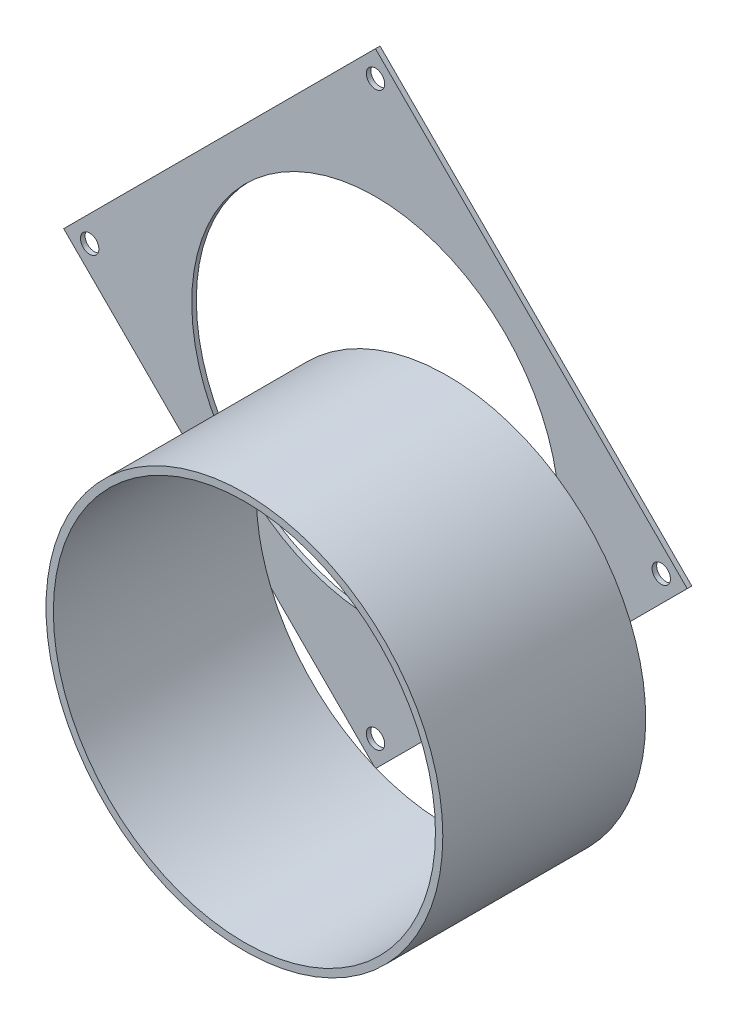
ISO-10303-21;
HEADER;
FILE_DESCRIPTION(('STEP AP214'),'2;1');
FILE_NAME('part.step','',(''),(''),'','','');
FILE_SCHEMA(('AUTOMOTIVE_DESIGN { 1 0 10303 214 1 1 1 1 }'));
ENDSEC;
DATA;
#1=APPLICATION_CONTEXT('core data for automotive mechanical design processes');
#2=APPLICATION_PROTOCOL_DEFINITION('international standard','automotive_design',2000,#1);
#3=PRODUCT_CONTEXT('',#1,'mechanical');
#4=PRODUCT('Part','Part','',(#3));
#5=PRODUCT_RELATED_PRODUCT_CATEGORY('part','',(#4));
#6=PRODUCT_DEFINITION_FORMATION('','',#4);
#7=PRODUCT_DEFINITION_CONTEXT('part definition',#1,'design');
#8=PRODUCT_DEFINITION('design','',#6,#7);
#9=PRODUCT_DEFINITION_SHAPE('','',#8);
#10=(LENGTH_UNIT() NAMED_UNIT(*) SI_UNIT(.MILLI.,.METRE.));
#11=(NAMED_UNIT(*) PLANE_ANGLE_UNIT() SI_UNIT($,.RADIAN.));
#12=(NAMED_UNIT(*) SI_UNIT($,.STERADIAN.) SOLID_ANGLE_UNIT());
#13=UNCERTAINTY_MEASURE_WITH_UNIT(LENGTH_MEASURE(1.E-05),#10,'distance_accuracy_value','');
#14=(GEOMETRIC_REPRESENTATION_CONTEXT(3) GLOBAL_UNCERTAINTY_ASSIGNED_CONTEXT((#13)) GLOBAL_UNIT_ASSIGNED_CONTEXT((#10,
#11,#12)) REPRESENTATION_CONTEXT('',''));
#15=CARTESIAN_POINT('',(0.,0.,0.));
#16=DIRECTION('',(0.,0.,1.));
#17=DIRECTION('',(1.,0.,0.));
#18=AXIS2_PLACEMENT_3D('',#15,#16,#17);
#19=CARTESIAN_POINT('',(24.8408137967855,-46.264409371767,-70.1401870600607));
#20=DIRECTION('',(0.,0.,-1.));
#21=DIRECTION('',(-1.,0.,0.));
#22=AXIS2_PLACEMENT_3D('',#19,#20,#21);
#23=PLANE('',#22);
#24=CARTESIAN_POINT('',(24.8408137967855,-46.264409371767,-70.1401870600608));
#25=DIRECTION('',(0.,0.,-1.));
#26=DIRECTION('',(-1.,0.,0.));
#27=AXIS2_PLACEMENT_3D('',#24,#25,#26);
#28=CIRCLE('',#27,68.58);
#29=CARTESIAN_POINT('',(62.5351597623169,11.0274110062837,-70.1401870600607));
#30=VERTEX_POINT('',#29);
#31=CARTESIAN_POINT('',(-43.7388005387028,-46.0344145985975,-70.1401870600607));
#32=VERTEX_POINT('',#31);
#33=EDGE_CURVE('E138',#30,#32,#28,.F.);
#34=ORIENTED_EDGE('',*,*,#33,.F.);
#35=CARTESIAN_POINT('',(0.,0.,-70.1401870600607));
#36=DIRECTION('',(0.,0.,-1.));
#37=DIRECTION('',(-1.,0.,0.));
#38=AXIS2_PLACEMENT_3D('',#35,#36,#37);
#39=CIRCLE('',#38,63.5);
#40=CARTESIAN_POINT('',(63.0429964344815,7.60464335534263,-70.1401870600607));
#41=VERTEX_POINT('',#40);
#42=EDGE_CURVE('E163',#30,#41,#39,.T.);
#43=ORIENTED_EDGE('',*,*,#42,.T.);
#44=CARTESIAN_POINT('',(24.8408137967855,-46.264409371767,-70.1401870600608));
#45=DIRECTION('',(0.,0.,-1.));
#46=DIRECTION('',(-1.,0.,0.));
#47=AXIS2_PLACEMENT_3D('',#44,#45,#46);
#48=CIRCLE('',#47,66.04);
#49=CARTESIAN_POINT('',(-41.1662901687704,-48.348594123724,-70.1401870600607));
#50=VERTEX_POINT('',#49);
#51=EDGE_CURVE('E147',#41,#50,#48,.F.);
#52=ORIENTED_EDGE('',*,*,#51,.T.);
#53=EDGE_CURVE('E165',#50,#32,#39,.T.);
#54=ORIENTED_EDGE('',*,*,#53,.T.);
#55=EDGE_LOOP('',(#34,#43,#52,#54));
#56=FACE_BOUND('',#55,.T.);
#57=ADVANCED_FACE('F35',(#56),#23,.T.);
#58=CARTESIAN_POINT('',(24.8408137967855,-46.264409371767,-264.113719275154));
#59=DIRECTION('',(0.,0.,1.));
#60=DIRECTION('',(1.,0.,0.));
#61=AXIS2_PLACEMENT_3D('',#58,#59,#60);
#62=CYLINDRICAL_SURFACE('',#61,68.58);
#63=CARTESIAN_POINT('',(24.8408137967855,-46.264409371767,0.));
#64=DIRECTION('',(0.,0.,1.));
#65=DIRECTION('',(1.,0.,0.));
#66=AXIS2_PLACEMENT_3D('',#63,#64,#65);
#67=CIRCLE('',#66,68.58);
#68=CARTESIAN_POINT('',(93.4208137967855,-46.264409371767,0.));
#69=VERTEX_POINT('',#68);
#70=EDGE_CURVE('E144',#69,#69,#67,.T.);
#71=ORIENTED_EDGE('',*,*,#70,.F.);
#72=EDGE_LOOP('',(#71));
#73=FACE_BOUND('',#72,.T.);
#74=CARTESIAN_POINT('',(-40.4192361391603,-67.3438373136696,-70.1401870600607));
#75=VERTEX_POINT('',#74);
#76=CARTESIAN_POINT('',(88.0658267766621,-19.6972466761678,-70.1401870600607));
#77=VERTEX_POINT('',#76);
#78=EDGE_CURVE('E139',#75,#77,#28,.F.);
#79=ORIENTED_EDGE('',*,*,#78,.T.);
#80=EDGE_CURVE('E151',#77,#30,#28,.F.);
#81=ORIENTED_EDGE('',*,*,#80,.T.);
#82=ORIENTED_EDGE('',*,*,#33,.T.);
#83=EDGE_CURVE('E135',#32,#75,#28,.F.);
#84=ORIENTED_EDGE('',*,*,#83,.T.);
#85=EDGE_LOOP('',(#79,#81,#82,#84));
#86=FACE_BOUND('',#85,.T.);
#87=ADVANCED_FACE('F157',(#73,#86),#62,.T.);
#88=CARTESIAN_POINT('',(24.8408137967855,-46.264409371767,-264.113719275154));
#89=DIRECTION('',(0.,0.,1.));
#90=DIRECTION('',(1.,0.,0.));
#91=AXIS2_PLACEMENT_3D('',#88,#89,#90);
#92=CYLINDRICAL_SURFACE('',#91,66.04);
#93=CARTESIAN_POINT('',(24.8408137967855,-46.264409371767,0.));
#94=DIRECTION('',(0.,0.,1.));
#95=DIRECTION('',(1.,0.,0.));
#96=AXIS2_PLACEMENT_3D('',#93,#94,#95);
#97=CIRCLE('',#96,66.04);
#98=CARTESIAN_POINT('',(90.8808137967855,-46.264409371767,0.));
#99=VERTEX_POINT('',#98);
#100=EDGE_CURVE('E148',#99,#99,#97,.T.);
#101=ORIENTED_EDGE('',*,*,#100,.T.);
#102=EDGE_LOOP('',(#101));
#103=FACE_BOUND('',#102,.T.);
#104=CARTESIAN_POINT('',(-36.1338244663452,-71.6292489864847,-70.1401870600607));
#105=VERTEX_POINT('',#104);
#106=EDGE_CURVE('E39',#50,#105,#48,.F.);
#107=ORIENTED_EDGE('',*,*,#106,.F.);
#108=ORIENTED_EDGE('',*,*,#51,.F.);
#109=CARTESIAN_POINT('',(86.1196085910416,-21.6434648617883,-70.1401870600607));
#110=VERTEX_POINT('',#109);
#111=EDGE_CURVE('E229',#110,#41,#48,.F.);
#112=ORIENTED_EDGE('',*,*,#111,.F.);
#113=CARTESIAN_POINT('',(0.219869286807436,-107.543204166023,-70.1401870600608));
#114=VERTEX_POINT('',#113);
#115=EDGE_CURVE('E224',#114,#110,#48,.F.);
#116=ORIENTED_EDGE('',*,*,#115,.F.);
#117=CARTESIAN_POINT('',(-0.524025817932385,-107.239047634898,-70.1401870600607));
#118=VERTEX_POINT('',#117);
#119=EDGE_CURVE('E228',#118,#114,#48,.F.);
#120=ORIENTED_EDGE('',*,*,#119,.F.);
#121=EDGE_CURVE('E172',#105,#118,#48,.F.);
#122=ORIENTED_EDGE('',*,*,#121,.F.);
#123=EDGE_LOOP('',(#107,#108,#112,#116,#120,#122));
#124=FACE_BOUND('',#123,.T.);
#125=ADVANCED_FACE('F231',(#103,#124),#92,.F.);
#126=CARTESIAN_POINT('',(24.8408137967855,-46.264409371767,0.));
#127=DIRECTION('',(0.,0.,1.));
#128=DIRECTION('',(1.,0.,0.));
#129=AXIS2_PLACEMENT_3D('',#126,#127,#128);
#130=PLANE('',#129);
#131=ORIENTED_EDGE('',*,*,#100,.F.);
#132=EDGE_LOOP('',(#131));
#133=FACE_BOUND('',#132,.T.);
#134=ORIENTED_EDGE('',*,*,#70,.T.);
#135=EDGE_LOOP('',(#134));
#136=FACE_BOUND('',#135,.T.);
#137=ADVANCED_FACE('F252',(#133,#136),#130,.T.);
#138=DIRECTION('',(-0.707106781186544,-0.707106781186551,0.));
#139=VECTOR('',#138,1.);
#140=CARTESIAN_POINT('',(3.84724584601496E-13,-107.76307345283,-70.1401870600607));
#141=LINE('',#140,#139);
#142=EDGE_CURVE('E11',#77,#110,#141,.T.);
#143=ORIENTED_EDGE('',*,*,#142,.F.);
#144=ORIENTED_EDGE('',*,*,#78,.F.);
#145=DIRECTION('',(-0.707106781186546,0.707106781186549,0.));
#146=VECTOR('',#145,1.);
#147=CARTESIAN_POINT('',(3.84724584601496E-13,-107.76307345283,-70.1401870600607));
#148=LINE('',#147,#146);
#149=EDGE_CURVE('E167',#105,#75,#148,.T.);
#150=ORIENTED_EDGE('',*,*,#149,.F.);
#151=ORIENTED_EDGE('',*,*,#121,.T.);
#152=CARTESIAN_POINT('',(3.84724584601496E-13,-107.76307345283,-70.1401870600607));
#153=VERTEX_POINT('',#152);
#154=EDGE_CURVE('E53',#153,#118,#148,.T.);
#155=ORIENTED_EDGE('',*,*,#154,.F.);
#156=EDGE_CURVE('E44',#114,#153,#141,.T.);
#157=ORIENTED_EDGE('',*,*,#156,.F.);
#158=ORIENTED_EDGE('',*,*,#115,.T.);
#159=EDGE_LOOP('',(#143,#144,#150,#151,#155,#157,#158));
#160=FACE_BOUND('',#159,.T.);
#161=ADVANCED_FACE('F37',(#160),#23,.T.);
#162=CARTESIAN_POINT('',(0.,0.,-70.1401870600607));
#163=DIRECTION('',(0.,0.,-1.));
#164=DIRECTION('',(-1.,0.,0.));
#165=AXIS2_PLACEMENT_3D('',#162,#163,#164);
#166=PLANE('',#165);
#167=CARTESIAN_POINT('',(0.,-98.7828173317607,-70.1401870600607));
#168=DIRECTION('',(0.,0.,-1.));
#169=DIRECTION('',(-1.,0.,0.));
#170=AXIS2_PLACEMENT_3D('',#167,#168,#169);
#171=CIRCLE('',#170,3.17499999999999);
#172=CARTESIAN_POINT('',(-3.17500000000002,-98.7828173317607,-70.1401870600607));
#173=VERTEX_POINT('',#172);
#174=EDGE_CURVE('E189',#173,#173,#171,.T.);
#175=ORIENTED_EDGE('',*,*,#174,.T.);
#176=EDGE_LOOP('',(#175));
#177=FACE_BOUND('',#176,.T.);
#178=EDGE_CURVE('E61',#41,#50,#39,.T.);
#179=ORIENTED_EDGE('',*,*,#178,.T.);
#180=ORIENTED_EDGE('',*,*,#106,.T.);
#181=EDGE_CURVE('E171',#118,#105,#148,.T.);
#182=ORIENTED_EDGE('',*,*,#181,.F.);
#183=ORIENTED_EDGE('',*,*,#119,.T.);
#184=EDGE_CURVE('E46',#110,#114,#141,.T.);
#185=ORIENTED_EDGE('',*,*,#184,.F.);
#186=ORIENTED_EDGE('',*,*,#111,.T.);
#187=EDGE_LOOP('',(#179,#180,#182,#183,#185,#186));
#188=FACE_BOUND('',#187,.T.);
#189=ADVANCED_FACE('F230',(#177,#188),#166,.F.);
#190=ORIENTED_EDGE('',*,*,#80,.F.);
#191=CARTESIAN_POINT('',(107.76307345283,0.,-70.1401870600607));
#192=VERTEX_POINT('',#191);
#193=EDGE_CURVE('E204',#192,#77,#141,.T.);
#194=ORIENTED_EDGE('',*,*,#193,.F.);
#195=DIRECTION('',(0.707106781186546,-0.707106781186549,0.));
#196=VECTOR('',#195,1.);
#197=CARTESIAN_POINT('',(0.,107.76307345283,-70.1401870600607));
#198=LINE('',#197,#196);
#199=CARTESIAN_POINT('',(0.,107.76307345283,-70.1401870600607));
#200=VERTEX_POINT('',#199);
#201=EDGE_CURVE('E130',#200,#192,#198,.T.);
#202=ORIENTED_EDGE('',*,*,#201,.F.);
#203=DIRECTION('',(0.707106781186546,0.707106781186549,0.));
#204=VECTOR('',#203,1.);
#205=CARTESIAN_POINT('',(0.,107.76307345283,-70.1401870600607));
#206=LINE('',#205,#204);
#207=CARTESIAN_POINT('',(-107.76307345283,0.,-70.1401870600607));
#208=VERTEX_POINT('',#207);
#209=EDGE_CURVE('E207',#208,#200,#206,.T.);
#210=ORIENTED_EDGE('',*,*,#209,.F.);
#211=EDGE_CURVE('E205',#75,#208,#148,.T.);
#212=ORIENTED_EDGE('',*,*,#211,.F.);
#213=ORIENTED_EDGE('',*,*,#83,.F.);
#214=EDGE_CURVE('E176',#32,#30,#39,.T.);
#215=ORIENTED_EDGE('',*,*,#214,.T.);
#216=EDGE_LOOP('',(#190,#194,#202,#210,#212,#213,#215));
#217=FACE_BOUND('',#216,.T.);
#218=CARTESIAN_POINT('',(0.,98.7828173317607,-70.1401870600607));
#219=DIRECTION('',(0.,0.,-1.));
#220=DIRECTION('',(-1.,0.,0.));
#221=AXIS2_PLACEMENT_3D('',#218,#219,#220);
#222=CIRCLE('',#221,3.17500000000002);
#223=CARTESIAN_POINT('',(-3.17500000000001,98.7828173317607,-70.1401870600607));
#224=VERTEX_POINT('',#223);
#225=EDGE_CURVE('E192',#224,#224,#222,.T.);
#226=ORIENTED_EDGE('',*,*,#225,.T.);
#227=EDGE_LOOP('',(#226));
#228=FACE_BOUND('',#227,.T.);
#229=CARTESIAN_POINT('',(-98.7828173317607,0.,-70.1401870600607));
#230=DIRECTION('',(0.,0.,-1.));
#231=DIRECTION('',(-1.,0.,0.));
#232=AXIS2_PLACEMENT_3D('',#229,#230,#231);
#233=CIRCLE('',#232,3.175);
#234=CARTESIAN_POINT('',(-101.957817331761,0.,-70.1401870600607));
#235=VERTEX_POINT('',#234);
#236=EDGE_CURVE('E181',#235,#235,#233,.T.);
#237=ORIENTED_EDGE('',*,*,#236,.T.);
#238=EDGE_LOOP('',(#237));
#239=FACE_BOUND('',#238,.T.);
#240=CARTESIAN_POINT('',(98.7828173317607,0.,-70.1401870600607));
#241=DIRECTION('',(0.,0.,-1.));
#242=DIRECTION('',(-1.,0.,0.));
#243=AXIS2_PLACEMENT_3D('',#240,#241,#242);
#244=CIRCLE('',#243,3.175);
#245=CARTESIAN_POINT('',(95.6078173317607,0.,-70.1401870600607));
#246=VERTEX_POINT('',#245);
#247=EDGE_CURVE('E304',#246,#246,#244,.T.);
#248=ORIENTED_EDGE('',*,*,#247,.T.);
#249=EDGE_LOOP('',(#248));
#250=FACE_BOUND('',#249,.T.);
#251=ADVANCED_FACE('F218',(#217,#228,#239,#250),#166,.F.);
#252=CARTESIAN_POINT('',(0.,0.,-71.7276870600607));
#253=DIRECTION('',(0.,0.,-1.));
#254=DIRECTION('',(-1.,0.,0.));
#255=AXIS2_PLACEMENT_3D('',#252,#253,#254);
#256=PLANE('',#255);
#257=CARTESIAN_POINT('',(0.,-98.7828173317607,-71.7276870600607));
#258=DIRECTION('',(0.,0.,-1.));
#259=DIRECTION('',(-1.,0.,0.));
#260=AXIS2_PLACEMENT_3D('',#257,#258,#259);
#261=CIRCLE('',#260,3.17499999999999);
#262=CARTESIAN_POINT('',(-3.17500000000002,-98.7828173317607,-71.7276870600607));
#263=VERTEX_POINT('',#262);
#264=EDGE_CURVE('E186',#263,#263,#261,.T.);
#265=ORIENTED_EDGE('',*,*,#264,.F.);
#266=EDGE_LOOP('',(#265));
#267=FACE_BOUND('',#266,.T.);
#268=CARTESIAN_POINT('',(0.,0.,-71.7276870600607));
#269=DIRECTION('',(0.,0.,-1.));
#270=DIRECTION('',(-1.,0.,0.));
#271=AXIS2_PLACEMENT_3D('',#268,#269,#270);
#272=CIRCLE('',#271,63.5);
#273=CARTESIAN_POINT('',(-63.5,0.,-71.7276870600607));
#274=VERTEX_POINT('',#273);
#275=EDGE_CURVE('E175',#274,#274,#272,.T.);
#276=ORIENTED_EDGE('',*,*,#275,.F.);
#277=EDGE_LOOP('',(#276));
#278=FACE_BOUND('',#277,.T.);
#279=DIRECTION('',(-0.707106781186544,-0.707106781186551,0.));
#280=VECTOR('',#279,1.);
#281=CARTESIAN_POINT('',(3.84724584601496E-13,-107.76307345283,-71.7276870600607));
#282=LINE('',#281,#280);
#283=CARTESIAN_POINT('',(107.76307345283,0.,-71.7276870600607));
#284=VERTEX_POINT('',#283);
#285=CARTESIAN_POINT('',(3.84724584601496E-13,-107.76307345283,-71.7276870600607));
#286=VERTEX_POINT('',#285);
#287=EDGE_CURVE('E120',#284,#286,#282,.T.);
#288=ORIENTED_EDGE('',*,*,#287,.T.);
#289=DIRECTION('',(-0.707106781186546,0.707106781186549,0.));
#290=VECTOR('',#289,1.);
#291=CARTESIAN_POINT('',(3.84724584601496E-13,-107.76307345283,-71.7276870600607));
#292=LINE('',#291,#290);
#293=CARTESIAN_POINT('',(-107.76307345283,0.,-71.7276870600607));
#294=VERTEX_POINT('',#293);
#295=EDGE_CURVE('E110',#286,#294,#292,.T.);
#296=ORIENTED_EDGE('',*,*,#295,.T.);
#297=DIRECTION('',(0.707106781186546,0.707106781186549,0.));
#298=VECTOR('',#297,1.);
#299=CARTESIAN_POINT('',(0.,107.76307345283,-71.7276870600607));
#300=LINE('',#299,#298);
#301=CARTESIAN_POINT('',(0.,107.76307345283,-71.7276870600607));
#302=VERTEX_POINT('',#301);
#303=EDGE_CURVE('E119',#294,#302,#300,.T.);
#304=ORIENTED_EDGE('',*,*,#303,.T.);
#305=DIRECTION('',(0.707106781186546,-0.707106781186549,0.));
#306=VECTOR('',#305,1.);
#307=CARTESIAN_POINT('',(0.,107.76307345283,-71.7276870600607));
#308=LINE('',#307,#306);
#309=EDGE_CURVE('E126',#302,#284,#308,.T.);
#310=ORIENTED_EDGE('',*,*,#309,.T.);
#311=EDGE_LOOP('',(#288,#296,#304,#310));
#312=FACE_BOUND('',#311,.T.);
#313=CARTESIAN_POINT('',(0.,98.7828173317607,-71.7276870600607));
#314=DIRECTION('',(0.,0.,-1.));
#315=DIRECTION('',(-1.,0.,0.));
#316=AXIS2_PLACEMENT_3D('',#313,#314,#315);
#317=CIRCLE('',#316,3.17500000000002);
#318=CARTESIAN_POINT('',(-3.17500000000001,98.7828173317607,-71.7276870600607));
#319=VERTEX_POINT('',#318);
#320=EDGE_CURVE('E196',#319,#319,#317,.T.);
#321=ORIENTED_EDGE('',*,*,#320,.F.);
#322=EDGE_LOOP('',(#321));
#323=FACE_BOUND('',#322,.T.);
#324=CARTESIAN_POINT('',(-98.7828173317607,0.,-71.7276870600607));
#325=DIRECTION('',(0.,0.,-1.));
#326=DIRECTION('',(-1.,0.,0.));
#327=AXIS2_PLACEMENT_3D('',#324,#325,#326);
#328=CIRCLE('',#327,3.175);
#329=CARTESIAN_POINT('',(-101.957817331761,0.,-71.7276870600607));
#330=VERTEX_POINT('',#329);
#331=EDGE_CURVE('E178',#330,#330,#328,.T.);
#332=ORIENTED_EDGE('',*,*,#331,.F.);
#333=EDGE_LOOP('',(#332));
#334=FACE_BOUND('',#333,.T.);
#335=CARTESIAN_POINT('',(98.7828173317607,0.,-71.7276870600607));
#336=DIRECTION('',(0.,0.,-1.));
#337=DIRECTION('',(-1.,0.,0.));
#338=AXIS2_PLACEMENT_3D('',#335,#336,#337);
#339=CIRCLE('',#338,3.175);
#340=CARTESIAN_POINT('',(95.6078173317607,0.,-71.7276870600607));
#341=VERTEX_POINT('',#340);
#342=EDGE_CURVE('E301',#341,#341,#339,.T.);
#343=ORIENTED_EDGE('',*,*,#342,.F.);
#344=EDGE_LOOP('',(#343));
#345=FACE_BOUND('',#344,.T.);
#346=ADVANCED_FACE('F123',(#267,#278,#312,#323,#334,#345),#256,.T.);
#347=CARTESIAN_POINT('',(3.84724584601496E-13,-107.76307345283,-71.7276870600607));
#348=DIRECTION('',(-0.707106781186551,0.707106781186544,0.));
#349=DIRECTION('',(-0.707106781186544,-0.707106781186551,0.));
#350=AXIS2_PLACEMENT_3D('',#347,#348,#349);
#351=PLANE('',#350);
#352=ORIENTED_EDGE('',*,*,#193,.T.);
#353=ORIENTED_EDGE('',*,*,#142,.T.);
#354=ORIENTED_EDGE('',*,*,#184,.T.);
#355=ORIENTED_EDGE('',*,*,#156,.T.);
#356=DIRECTION('',(0.,0.,1.));
#357=VECTOR('',#356,1.);
#358=CARTESIAN_POINT('',(3.84724584601496E-13,-107.76307345283,-71.7276870600607));
#359=LINE('',#358,#357);
#360=EDGE_CURVE('E114',#286,#153,#359,.T.);
#361=ORIENTED_EDGE('',*,*,#360,.F.);
#362=ORIENTED_EDGE('',*,*,#287,.F.);
#363=DIRECTION('',(0.,0.,1.));
#364=VECTOR('',#363,1.);
#365=CARTESIAN_POINT('',(107.76307345283,0.,-71.7276870600607));
#366=LINE('',#365,#364);
#367=EDGE_CURVE('E203',#284,#192,#366,.T.);
#368=ORIENTED_EDGE('',*,*,#367,.T.);
#369=EDGE_LOOP('',(#352,#353,#354,#355,#361,#362,#368));
#370=FACE_BOUND('',#369,.T.);
#371=ADVANCED_FACE('F133',(#370),#351,.F.);
#372=CARTESIAN_POINT('',(3.84724584601496E-13,-107.76307345283,-71.7276870600607));
#373=DIRECTION('',(0.707106781186549,0.707106781186546,0.));
#374=DIRECTION('',(-0.707106781186546,0.707106781186549,0.));
#375=AXIS2_PLACEMENT_3D('',#372,#373,#374);
#376=PLANE('',#375);
#377=ORIENTED_EDGE('',*,*,#154,.T.);
#378=ORIENTED_EDGE('',*,*,#181,.T.);
#379=ORIENTED_EDGE('',*,*,#149,.T.);
#380=ORIENTED_EDGE('',*,*,#211,.T.);
#381=DIRECTION('',(0.,0.,1.));
#382=VECTOR('',#381,1.);
#383=CARTESIAN_POINT('',(-107.76307345283,0.,-71.7276870600607));
#384=LINE('',#383,#382);
#385=EDGE_CURVE('E116',#294,#208,#384,.T.);
#386=ORIENTED_EDGE('',*,*,#385,.F.);
#387=ORIENTED_EDGE('',*,*,#295,.F.);
#388=ORIENTED_EDGE('',*,*,#360,.T.);
#389=EDGE_LOOP('',(#377,#378,#379,#380,#386,#387,#388));
#390=FACE_BOUND('',#389,.T.);
#391=ADVANCED_FACE('F112',(#390),#376,.F.);
#392=CARTESIAN_POINT('',(0.,107.76307345283,-71.7276870600607));
#393=DIRECTION('',(0.707106781186549,-0.707106781186546,0.));
#394=DIRECTION('',(0.707106781186546,0.707106781186549,0.));
#395=AXIS2_PLACEMENT_3D('',#392,#393,#394);
#396=PLANE('',#395);
#397=ORIENTED_EDGE('',*,*,#209,.T.);
#398=DIRECTION('',(0.,0.,1.));
#399=VECTOR('',#398,1.);
#400=CARTESIAN_POINT('',(0.,107.76307345283,-71.7276870600607));
#401=LINE('',#400,#399);
#402=EDGE_CURVE('E140',#302,#200,#401,.T.);
#403=ORIENTED_EDGE('',*,*,#402,.F.);
#404=ORIENTED_EDGE('',*,*,#303,.F.);
#405=ORIENTED_EDGE('',*,*,#385,.T.);
#406=EDGE_LOOP('',(#397,#403,#404,#405));
#407=FACE_BOUND('',#406,.T.);
#408=ADVANCED_FACE('F235',(#407),#396,.F.);
#409=CARTESIAN_POINT('',(0.,107.76307345283,-71.7276870600607));
#410=DIRECTION('',(-0.707106781186549,-0.707106781186546,0.));
#411=DIRECTION('',(0.707106781186546,-0.707106781186549,0.));
#412=AXIS2_PLACEMENT_3D('',#409,#410,#411);
#413=PLANE('',#412);
#414=ORIENTED_EDGE('',*,*,#201,.T.);
#415=ORIENTED_EDGE('',*,*,#367,.F.);
#416=ORIENTED_EDGE('',*,*,#309,.F.);
#417=ORIENTED_EDGE('',*,*,#402,.T.);
#418=EDGE_LOOP('',(#414,#415,#416,#417));
#419=FACE_BOUND('',#418,.T.);
#420=ADVANCED_FACE('F214',(#419),#413,.F.);
#421=CARTESIAN_POINT('',(0.,98.7828173317607,-71.7276870600607));
#422=DIRECTION('',(0.,0.,1.));
#423=DIRECTION('',(1.,0.,0.));
#424=AXIS2_PLACEMENT_3D('',#421,#422,#423);
#425=CYLINDRICAL_SURFACE('',#424,3.17500000000002);
#426=ORIENTED_EDGE('',*,*,#320,.T.);
#427=EDGE_LOOP('',(#426));
#428=FACE_BOUND('',#427,.T.);
#429=ORIENTED_EDGE('',*,*,#225,.F.);
#430=EDGE_LOOP('',(#429));
#431=FACE_BOUND('',#430,.T.);
#432=ADVANCED_FACE('F242',(#428,#431),#425,.F.);
#433=CARTESIAN_POINT('',(0.,0.,-71.7276870600607));
#434=DIRECTION('',(0.,0.,1.));
#435=DIRECTION('',(1.,0.,0.));
#436=AXIS2_PLACEMENT_3D('',#433,#434,#435);
#437=CYLINDRICAL_SURFACE('',#436,63.5);
#438=ORIENTED_EDGE('',*,*,#275,.T.);
#439=EDGE_LOOP('',(#438));
#440=FACE_BOUND('',#439,.T.);
#441=ORIENTED_EDGE('',*,*,#42,.F.);
#442=ORIENTED_EDGE('',*,*,#214,.F.);
#443=ORIENTED_EDGE('',*,*,#53,.F.);
#444=ORIENTED_EDGE('',*,*,#178,.F.);
#445=EDGE_LOOP('',(#441,#442,#443,#444));
#446=FACE_BOUND('',#445,.T.);
#447=ADVANCED_FACE('F282',(#440,#446),#437,.F.);
#448=CARTESIAN_POINT('',(-98.7828173317607,0.,-71.7276870600607));
#449=DIRECTION('',(0.,0.,1.));
#450=DIRECTION('',(1.,0.,0.));
#451=AXIS2_PLACEMENT_3D('',#448,#449,#450);
#452=CYLINDRICAL_SURFACE('',#451,3.175);
#453=ORIENTED_EDGE('',*,*,#331,.T.);
#454=EDGE_LOOP('',(#453));
#455=FACE_BOUND('',#454,.T.);
#456=ORIENTED_EDGE('',*,*,#236,.F.);
#457=EDGE_LOOP('',(#456));
#458=FACE_BOUND('',#457,.T.);
#459=ADVANCED_FACE('F286',(#455,#458),#452,.F.);
#460=CARTESIAN_POINT('',(0.,-98.7828173317607,-71.7276870600607));
#461=DIRECTION('',(0.,0.,1.));
#462=DIRECTION('',(1.,0.,0.));
#463=AXIS2_PLACEMENT_3D('',#460,#461,#462);
#464=CYLINDRICAL_SURFACE('',#463,3.17499999999999);
#465=ORIENTED_EDGE('',*,*,#264,.T.);
#466=EDGE_LOOP('',(#465));
#467=FACE_BOUND('',#466,.T.);
#468=ORIENTED_EDGE('',*,*,#174,.F.);
#469=EDGE_LOOP('',(#468));
#470=FACE_BOUND('',#469,.T.);
#471=ADVANCED_FACE('F289',(#467,#470),#464,.F.);
#472=CARTESIAN_POINT('',(98.7828173317607,0.,-71.7276870600607));
#473=DIRECTION('',(0.,0.,1.));
#474=DIRECTION('',(1.,0.,0.));
#475=AXIS2_PLACEMENT_3D('',#472,#473,#474);
#476=CYLINDRICAL_SURFACE('',#475,3.175);
#477=ORIENTED_EDGE('',*,*,#342,.T.);
#478=EDGE_LOOP('',(#477));
#479=FACE_BOUND('',#478,.T.);
#480=ORIENTED_EDGE('',*,*,#247,.F.);
#481=EDGE_LOOP('',(#480));
#482=FACE_BOUND('',#481,.T.);
#483=ADVANCED_FACE('F292',(#479,#482),#476,.F.);
#484=CLOSED_SHELL('',(#57,#87,#125,#137,#161,#189,#251,#346,#371,#391,#408,#420,#432,#447,#459,
#471,#483));
#485=MANIFOLD_SOLID_BREP('B2',#484);
#486=ADVANCED_BREP_SHAPE_REPRESENTATION('',(#18,#485),#14);
#487=SHAPE_DEFINITION_REPRESENTATION(#9,#486);
ENDSEC;
END-ISO-10303-21;
